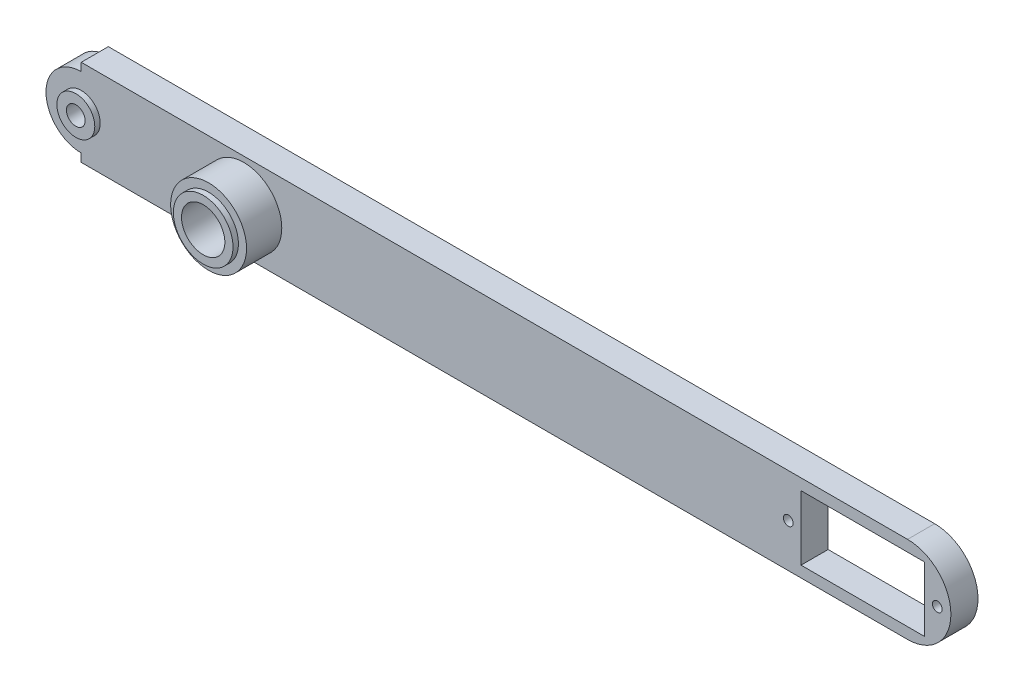
ISO-10303-21;
HEADER;
FILE_DESCRIPTION(('STEP AP214'),'2;1');
FILE_NAME('part.step','',(''),(''),'','','');
FILE_SCHEMA(('AUTOMOTIVE_DESIGN { 1 0 10303 214 1 1 1 1 }'));
ENDSEC;
DATA;
#1=APPLICATION_CONTEXT('core data for automotive mechanical design processes');
#2=APPLICATION_PROTOCOL_DEFINITION('international standard','automotive_design',2000,#1);
#3=PRODUCT_CONTEXT('',#1,'mechanical');
#4=PRODUCT('Part','Part','',(#3));
#5=PRODUCT_RELATED_PRODUCT_CATEGORY('part','',(#4));
#6=PRODUCT_DEFINITION_FORMATION('','',#4);
#7=PRODUCT_DEFINITION_CONTEXT('part definition',#1,'design');
#8=PRODUCT_DEFINITION('design','',#6,#7);
#9=PRODUCT_DEFINITION_SHAPE('','',#8);
#10=(LENGTH_UNIT() NAMED_UNIT(*) SI_UNIT(.MILLI.,.METRE.));
#11=(NAMED_UNIT(*) PLANE_ANGLE_UNIT() SI_UNIT($,.RADIAN.));
#12=(NAMED_UNIT(*) SI_UNIT($,.STERADIAN.) SOLID_ANGLE_UNIT());
#13=UNCERTAINTY_MEASURE_WITH_UNIT(LENGTH_MEASURE(1.E-05),#10,'distance_accuracy_value','');
#14=(GEOMETRIC_REPRESENTATION_CONTEXT(3) GLOBAL_UNCERTAINTY_ASSIGNED_CONTEXT((#13)) GLOBAL_UNIT_ASSIGNED_CONTEXT((#10,
#11,#12)) REPRESENTATION_CONTEXT('',''));
#15=CARTESIAN_POINT('',(0.,0.,0.));
#16=DIRECTION('',(0.,0.,1.));
#17=DIRECTION('',(1.,0.,0.));
#18=AXIS2_PLACEMENT_3D('',#15,#16,#17);
#19=CARTESIAN_POINT('',(-30.,8.,-4.));
#20=DIRECTION('',(1.,0.,0.));
#21=DIRECTION('',(0.,0.,-1.));
#22=AXIS2_PLACEMENT_3D('',#19,#20,#21);
#23=PLANE('',#22);
#24=DIRECTION('',(0.,0.,-1.));
#25=VECTOR('',#24,1.);
#26=CARTESIAN_POINT('',(-30.,-6.5,-4.));
#27=LINE('',#26,#25);
#28=CARTESIAN_POINT('',(-30.,-6.5,-9.));
#29=VERTEX_POINT('',#28);
#30=CARTESIAN_POINT('',(-30.,-6.5,-4.));
#31=VERTEX_POINT('',#30);
#32=EDGE_CURVE('E196',#29,#31,#27,.F.);
#33=ORIENTED_EDGE('',*,*,#32,.F.);
#34=DIRECTION('',(0.,-1.,0.));
#35=VECTOR('',#34,1.);
#36=CARTESIAN_POINT('',(-30.,8.,-9.));
#37=LINE('',#36,#35);
#38=CARTESIAN_POINT('',(-30.,-8.,-9.));
#39=VERTEX_POINT('',#38);
#40=EDGE_CURVE('E198',#29,#39,#37,.T.);
#41=ORIENTED_EDGE('',*,*,#40,.T.);
#42=DIRECTION('',(0.,0.,-1.));
#43=VECTOR('',#42,1.);
#44=CARTESIAN_POINT('',(-30.,-8.,-4.));
#45=LINE('',#44,#43);
#46=CARTESIAN_POINT('',(-30.,-8.,-4.));
#47=VERTEX_POINT('',#46);
#48=EDGE_CURVE('E50',#47,#39,#45,.T.);
#49=ORIENTED_EDGE('',*,*,#48,.F.);
#50=DIRECTION('',(0.,-1.,0.));
#51=VECTOR('',#50,1.);
#52=CARTESIAN_POINT('',(-30.,8.,-4.));
#53=LINE('',#52,#51);
#54=EDGE_CURVE('E203',#31,#47,#53,.T.);
#55=ORIENTED_EDGE('',*,*,#54,.F.);
#56=EDGE_LOOP('',(#33,#41,#49,#55));
#57=FACE_BOUND('',#56,.T.);
#58=ADVANCED_FACE('F39',(#57),#23,.F.);
#59=DIRECTION('',(0.,0.,-1.));
#60=VECTOR('',#59,1.);
#61=CARTESIAN_POINT('',(-30.,6.5,-4.));
#62=LINE('',#61,#60);
#63=CARTESIAN_POINT('',(-30.,6.5,-4.));
#64=VERTEX_POINT('',#63);
#65=CARTESIAN_POINT('',(-30.,6.5,-9.));
#66=VERTEX_POINT('',#65);
#67=EDGE_CURVE('E193',#64,#66,#62,.T.);
#68=ORIENTED_EDGE('',*,*,#67,.F.);
#69=CARTESIAN_POINT('',(-30.,8.,-4.));
#70=VERTEX_POINT('',#69);
#71=EDGE_CURVE('E200',#70,#64,#53,.T.);
#72=ORIENTED_EDGE('',*,*,#71,.F.);
#73=DIRECTION('',(0.,0.,-1.));
#74=VECTOR('',#73,1.);
#75=CARTESIAN_POINT('',(-30.,8.,-4.));
#76=LINE('',#75,#74);
#77=CARTESIAN_POINT('',(-30.,8.,-9.));
#78=VERTEX_POINT('',#77);
#79=EDGE_CURVE('E209',#70,#78,#76,.T.);
#80=ORIENTED_EDGE('',*,*,#79,.T.);
#81=EDGE_CURVE('E208',#78,#66,#37,.T.);
#82=ORIENTED_EDGE('',*,*,#81,.T.);
#83=EDGE_LOOP('',(#68,#72,#80,#82));
#84=FACE_BOUND('',#83,.T.);
#85=ADVANCED_FACE('F249',(#84),#23,.F.);
#86=CARTESIAN_POINT('',(-30.,-8.,-4.));
#87=DIRECTION('',(0.,1.,0.));
#88=DIRECTION('',(0.,0.,1.));
#89=AXIS2_PLACEMENT_3D('',#86,#87,#88);
#90=PLANE('',#89);
#91=DIRECTION('',(1.,0.,0.));
#92=VECTOR('',#91,1.);
#93=CARTESIAN_POINT('',(-30.,-8.,-9.));
#94=LINE('',#93,#92);
#95=CARTESIAN_POINT('',(122.45,-7.99999999999999,-9.));
#96=VERTEX_POINT('',#95);
#97=EDGE_CURVE('E214',#39,#96,#94,.T.);
#98=ORIENTED_EDGE('',*,*,#97,.T.);
#99=DIRECTION('',(0.,0.,-1.));
#100=VECTOR('',#99,1.);
#101=CARTESIAN_POINT('',(122.45,-8.,-4.));
#102=LINE('',#101,#100);
#103=CARTESIAN_POINT('',(122.45,-7.99999999999999,-4.));
#104=VERTEX_POINT('',#103);
#105=EDGE_CURVE('E225',#104,#96,#102,.T.);
#106=ORIENTED_EDGE('',*,*,#105,.F.);
#107=DIRECTION('',(1.,0.,0.));
#108=VECTOR('',#107,1.);
#109=CARTESIAN_POINT('',(-30.,-8.,-4.));
#110=LINE('',#109,#108);
#111=EDGE_CURVE('E202',#47,#104,#110,.T.);
#112=ORIENTED_EDGE('',*,*,#111,.F.);
#113=ORIENTED_EDGE('',*,*,#48,.T.);
#114=EDGE_LOOP('',(#98,#106,#112,#113));
#115=FACE_BOUND('',#114,.T.);
#116=ADVANCED_FACE('F227',(#115),#90,.F.);
#117=CARTESIAN_POINT('',(122.45,8.,-4.));
#118=DIRECTION('',(0.,-1.,0.));
#119=DIRECTION('',(0.,0.,-1.));
#120=AXIS2_PLACEMENT_3D('',#117,#118,#119);
#121=PLANE('',#120);
#122=DIRECTION('',(-1.,0.,0.));
#123=VECTOR('',#122,1.);
#124=CARTESIAN_POINT('',(122.45,8.,-9.));
#125=LINE('',#124,#123);
#126=CARTESIAN_POINT('',(122.45,8.,-9.));
#127=VERTEX_POINT('',#126);
#128=EDGE_CURVE('E211',#127,#78,#125,.T.);
#129=ORIENTED_EDGE('',*,*,#128,.T.);
#130=ORIENTED_EDGE('',*,*,#79,.F.);
#131=DIRECTION('',(-1.,0.,0.));
#132=VECTOR('',#131,1.);
#133=CARTESIAN_POINT('',(122.45,8.,-4.));
#134=LINE('',#133,#132);
#135=CARTESIAN_POINT('',(122.45,7.99999999999999,-4.));
#136=VERTEX_POINT('',#135);
#137=EDGE_CURVE('E210',#136,#70,#134,.T.);
#138=ORIENTED_EDGE('',*,*,#137,.F.);
#139=DIRECTION('',(0.,0.,-1.));
#140=VECTOR('',#139,1.);
#141=CARTESIAN_POINT('',(122.45,8.,-4.));
#142=LINE('',#141,#140);
#143=EDGE_CURVE('E218',#136,#127,#142,.T.);
#144=ORIENTED_EDGE('',*,*,#143,.T.);
#145=EDGE_LOOP('',(#129,#130,#138,#144));
#146=FACE_BOUND('',#145,.T.);
#147=ADVANCED_FACE('F241',(#146),#121,.F.);
#148=CARTESIAN_POINT('',(0.,0.,-4.));
#149=DIRECTION('',(0.,0.,1.));
#150=DIRECTION('',(1.,0.,0.));
#151=AXIS2_PLACEMENT_3D('',#148,#149,#150);
#152=PLANE('',#151);
#153=CARTESIAN_POINT('',(100.45,0.,-4.));
#154=DIRECTION('',(0.,0.,1.));
#155=DIRECTION('',(1.,0.,0.));
#156=AXIS2_PLACEMENT_3D('',#153,#154,#155);
#157=CIRCLE('',#156,0.899999999999998);
#158=CARTESIAN_POINT('',(101.35,0.,-4.));
#159=VERTEX_POINT('',#158);
#160=EDGE_CURVE('E136',#159,#159,#157,.T.);
#161=ORIENTED_EDGE('',*,*,#160,.F.);
#162=EDGE_LOOP('',(#161));
#163=FACE_BOUND('',#162,.T.);
#164=CARTESIAN_POINT('',(127.95,0.,-4.));
#165=DIRECTION('',(0.,0.,1.));
#166=DIRECTION('',(1.,0.,0.));
#167=AXIS2_PLACEMENT_3D('',#164,#165,#166);
#168=CIRCLE('',#167,0.900000000000012);
#169=CARTESIAN_POINT('',(128.85,0.,-4.));
#170=VERTEX_POINT('',#169);
#171=EDGE_CURVE('E138',#170,#170,#168,.T.);
#172=ORIENTED_EDGE('',*,*,#171,.F.);
#173=EDGE_LOOP('',(#172));
#174=FACE_BOUND('',#173,.T.);
#175=DIRECTION('',(0.,-1.,0.));
#176=VECTOR('',#175,1.);
#177=CARTESIAN_POINT('',(102.8,0.,-4.));
#178=LINE('',#177,#176);
#179=CARTESIAN_POINT('',(102.8,5.95,-4.));
#180=VERTEX_POINT('',#179);
#181=CARTESIAN_POINT('',(102.8,-5.95,-4.));
#182=VERTEX_POINT('',#181);
#183=EDGE_CURVE('E124',#180,#182,#178,.T.);
#184=ORIENTED_EDGE('',*,*,#183,.F.);
#185=DIRECTION('',(-1.,0.,0.));
#186=VECTOR('',#185,1.);
#187=CARTESIAN_POINT('',(0.,5.95,-4.));
#188=LINE('',#187,#186);
#189=CARTESIAN_POINT('',(125.6,5.95,-4.));
#190=VERTEX_POINT('',#189);
#191=EDGE_CURVE('E155',#190,#180,#188,.T.);
#192=ORIENTED_EDGE('',*,*,#191,.F.);
#193=DIRECTION('',(0.,1.,0.));
#194=VECTOR('',#193,1.);
#195=CARTESIAN_POINT('',(125.6,0.,-4.));
#196=LINE('',#195,#194);
#197=CARTESIAN_POINT('',(125.6,-5.95,-4.));
#198=VERTEX_POINT('',#197);
#199=EDGE_CURVE('E154',#198,#190,#196,.T.);
#200=ORIENTED_EDGE('',*,*,#199,.F.);
#201=DIRECTION('',(1.,0.,0.));
#202=VECTOR('',#201,1.);
#203=CARTESIAN_POINT('',(0.,-5.95,-4.));
#204=LINE('',#203,#202);
#205=EDGE_CURVE('E149',#182,#198,#204,.T.);
#206=ORIENTED_EDGE('',*,*,#205,.F.);
#207=EDGE_LOOP('',(#184,#192,#200,#206));
#208=FACE_BOUND('',#207,.T.);
#209=CARTESIAN_POINT('',(-30.,0.,-4.));
#210=DIRECTION('',(0.,0.,1.));
#211=DIRECTION('',(1.,0.,0.));
#212=AXIS2_PLACEMENT_3D('',#209,#210,#211);
#213=CIRCLE('',#212,3.5);
#214=CARTESIAN_POINT('',(-26.5,0.,-4.));
#215=VERTEX_POINT('',#214);
#216=EDGE_CURVE('E170',#215,#215,#213,.T.);
#217=ORIENTED_EDGE('',*,*,#216,.F.);
#218=EDGE_LOOP('',(#217));
#219=FACE_BOUND('',#218,.T.);
#220=CARTESIAN_POINT('',(0.,0.,-4.));
#221=DIRECTION('',(0.,0.,1.));
#222=DIRECTION('',(1.,0.,0.));
#223=AXIS2_PLACEMENT_3D('',#220,#221,#222);
#224=CIRCLE('',#223,7.);
#225=CARTESIAN_POINT('',(7.,0.,-4.));
#226=VERTEX_POINT('',#225);
#227=EDGE_CURVE('E177',#226,#226,#224,.F.);
#228=ORIENTED_EDGE('',*,*,#227,.T.);
#229=EDGE_LOOP('',(#228));
#230=FACE_BOUND('',#229,.T.);
#231=ORIENTED_EDGE('',*,*,#111,.T.);
#232=CARTESIAN_POINT('',(122.45,0.,-4.));
#233=DIRECTION('',(0.,0.,1.));
#234=DIRECTION('',(1.,0.,0.));
#235=AXIS2_PLACEMENT_3D('',#232,#233,#234);
#236=CIRCLE('',#235,7.99999999999999);
#237=EDGE_CURVE('E182',#104,#136,#236,.T.);
#238=ORIENTED_EDGE('',*,*,#237,.T.);
#239=ORIENTED_EDGE('',*,*,#137,.T.);
#240=ORIENTED_EDGE('',*,*,#71,.T.);
#241=CARTESIAN_POINT('',(-30.,0.,-4.));
#242=DIRECTION('',(0.,0.,1.));
#243=DIRECTION('',(1.,0.,0.));
#244=AXIS2_PLACEMENT_3D('',#241,#242,#243);
#245=CIRCLE('',#244,6.5);
#246=EDGE_CURVE('E189',#64,#31,#245,.T.);
#247=ORIENTED_EDGE('',*,*,#246,.T.);
#248=ORIENTED_EDGE('',*,*,#54,.T.);
#249=EDGE_LOOP('',(#231,#238,#239,#240,#247,#248));
#250=FACE_BOUND('',#249,.T.);
#251=ADVANCED_FACE('F244',(#163,#174,#208,#219,#230,#250),#152,.T.);
#252=CARTESIAN_POINT('',(0.,0.,-9.));
#253=DIRECTION('',(0.,0.,1.));
#254=DIRECTION('',(1.,0.,0.));
#255=AXIS2_PLACEMENT_3D('',#252,#253,#254);
#256=PLANE('',#255);
#257=CARTESIAN_POINT('',(100.45,0.,-9.));
#258=DIRECTION('',(0.,0.,1.));
#259=DIRECTION('',(1.,0.,0.));
#260=AXIS2_PLACEMENT_3D('',#257,#258,#259);
#261=CIRCLE('',#260,0.899999999999998);
#262=CARTESIAN_POINT('',(101.35,0.,-9.));
#263=VERTEX_POINT('',#262);
#264=EDGE_CURVE('E476',#263,#263,#261,.T.);
#265=ORIENTED_EDGE('',*,*,#264,.T.);
#266=EDGE_LOOP('',(#265));
#267=FACE_BOUND('',#266,.T.);
#268=CARTESIAN_POINT('',(127.95,0.,-9.));
#269=DIRECTION('',(0.,0.,1.));
#270=DIRECTION('',(1.,0.,0.));
#271=AXIS2_PLACEMENT_3D('',#268,#269,#270);
#272=CIRCLE('',#271,0.900000000000012);
#273=CARTESIAN_POINT('',(128.85,0.,-9.));
#274=VERTEX_POINT('',#273);
#275=EDGE_CURVE('E479',#274,#274,#272,.T.);
#276=ORIENTED_EDGE('',*,*,#275,.T.);
#277=EDGE_LOOP('',(#276));
#278=FACE_BOUND('',#277,.T.);
#279=DIRECTION('',(-1.,0.,0.));
#280=VECTOR('',#279,1.);
#281=CARTESIAN_POINT('',(125.6,5.95,-9.));
#282=LINE('',#281,#280);
#283=CARTESIAN_POINT('',(125.6,5.95,-9.));
#284=VERTEX_POINT('',#283);
#285=CARTESIAN_POINT('',(102.8,5.95,-9.));
#286=VERTEX_POINT('',#285);
#287=EDGE_CURVE('E128',#284,#286,#282,.T.);
#288=ORIENTED_EDGE('',*,*,#287,.T.);
#289=DIRECTION('',(0.,-1.,0.));
#290=VECTOR('',#289,1.);
#291=CARTESIAN_POINT('',(102.8,5.95,-9.));
#292=LINE('',#291,#290);
#293=CARTESIAN_POINT('',(102.8,-5.95,-9.));
#294=VERTEX_POINT('',#293);
#295=EDGE_CURVE('E119',#286,#294,#292,.T.);
#296=ORIENTED_EDGE('',*,*,#295,.T.);
#297=DIRECTION('',(1.,0.,0.));
#298=VECTOR('',#297,1.);
#299=CARTESIAN_POINT('',(102.8,-5.95,-9.));
#300=LINE('',#299,#298);
#301=CARTESIAN_POINT('',(125.6,-5.95,-9.));
#302=VERTEX_POINT('',#301);
#303=EDGE_CURVE('E130',#294,#302,#300,.T.);
#304=ORIENTED_EDGE('',*,*,#303,.T.);
#305=DIRECTION('',(0.,1.,0.));
#306=VECTOR('',#305,1.);
#307=CARTESIAN_POINT('',(125.6,-5.95,-9.));
#308=LINE('',#307,#306);
#309=EDGE_CURVE('E62',#302,#284,#308,.T.);
#310=ORIENTED_EDGE('',*,*,#309,.T.);
#311=EDGE_LOOP('',(#288,#296,#304,#310));
#312=FACE_BOUND('',#311,.T.);
#313=CARTESIAN_POINT('',(-30.,0.,-9.));
#314=DIRECTION('',(0.,0.,1.));
#315=DIRECTION('',(1.,0.,0.));
#316=AXIS2_PLACEMENT_3D('',#313,#314,#315);
#317=CIRCLE('',#316,1.725);
#318=CARTESIAN_POINT('',(-28.275,0.,-9.));
#319=VERTEX_POINT('',#318);
#320=EDGE_CURVE('E157',#319,#319,#317,.T.);
#321=ORIENTED_EDGE('',*,*,#320,.T.);
#322=EDGE_LOOP('',(#321));
#323=FACE_BOUND('',#322,.T.);
#324=CARTESIAN_POINT('',(0.,0.,-9.));
#325=DIRECTION('',(0.,0.,1.));
#326=DIRECTION('',(1.,0.,0.));
#327=AXIS2_PLACEMENT_3D('',#324,#325,#326);
#328=CIRCLE('',#327,4.);
#329=CARTESIAN_POINT('',(4.,0.,-9.));
#330=VERTEX_POINT('',#329);
#331=EDGE_CURVE('E165',#330,#330,#328,.T.);
#332=ORIENTED_EDGE('',*,*,#331,.T.);
#333=EDGE_LOOP('',(#332));
#334=FACE_BOUND('',#333,.T.);
#335=ORIENTED_EDGE('',*,*,#128,.F.);
#336=CARTESIAN_POINT('',(122.45,0.,-9.));
#337=DIRECTION('',(0.,0.,1.));
#338=DIRECTION('',(1.,0.,0.));
#339=AXIS2_PLACEMENT_3D('',#336,#337,#338);
#340=CIRCLE('',#339,7.99999999999999);
#341=EDGE_CURVE('E185',#96,#127,#340,.T.);
#342=ORIENTED_EDGE('',*,*,#341,.F.);
#343=ORIENTED_EDGE('',*,*,#97,.F.);
#344=ORIENTED_EDGE('',*,*,#40,.F.);
#345=CARTESIAN_POINT('',(-30.,0.,-9.));
#346=DIRECTION('',(0.,0.,1.));
#347=DIRECTION('',(1.,0.,0.));
#348=AXIS2_PLACEMENT_3D('',#345,#346,#347);
#349=CIRCLE('',#348,6.5);
#350=EDGE_CURVE('E187',#66,#29,#349,.T.);
#351=ORIENTED_EDGE('',*,*,#350,.F.);
#352=ORIENTED_EDGE('',*,*,#81,.F.);
#353=EDGE_LOOP('',(#335,#342,#343,#344,#351,#352));
#354=FACE_BOUND('',#353,.T.);
#355=ADVANCED_FACE('F134',(#267,#278,#312,#323,#334,#354),#256,.F.);
#356=CARTESIAN_POINT('',(-30.,0.,-4.));
#357=DIRECTION('',(0.,0.,-1.));
#358=DIRECTION('',(-1.,0.,0.));
#359=AXIS2_PLACEMENT_3D('',#356,#357,#358);
#360=CYLINDRICAL_SURFACE('',#359,6.5);
#361=ORIENTED_EDGE('',*,*,#350,.T.);
#362=ORIENTED_EDGE('',*,*,#32,.T.);
#363=ORIENTED_EDGE('',*,*,#246,.F.);
#364=ORIENTED_EDGE('',*,*,#67,.T.);
#365=EDGE_LOOP('',(#361,#362,#363,#364));
#366=FACE_BOUND('',#365,.T.);
#367=ADVANCED_FACE('F247',(#366),#360,.T.);
#368=CARTESIAN_POINT('',(122.45,0.,-4.));
#369=DIRECTION('',(0.,0.,-1.));
#370=DIRECTION('',(-1.,0.,0.));
#371=AXIS2_PLACEMENT_3D('',#368,#369,#370);
#372=CYLINDRICAL_SURFACE('',#371,7.99999999999999);
#373=ORIENTED_EDGE('',*,*,#237,.F.);
#374=ORIENTED_EDGE('',*,*,#105,.T.);
#375=ORIENTED_EDGE('',*,*,#341,.T.);
#376=ORIENTED_EDGE('',*,*,#143,.F.);
#377=EDGE_LOOP('',(#373,#374,#375,#376));
#378=FACE_BOUND('',#377,.T.);
#379=ADVANCED_FACE('F238',(#378),#372,.T.);
#380=CARTESIAN_POINT('',(0.,0.,2.5));
#381=DIRECTION('',(0.,0.,-1.));
#382=DIRECTION('',(-1.,0.,0.));
#383=AXIS2_PLACEMENT_3D('',#380,#381,#382);
#384=CYLINDRICAL_SURFACE('',#383,7.);
#385=ORIENTED_EDGE('',*,*,#227,.F.);
#386=EDGE_LOOP('',(#385));
#387=FACE_BOUND('',#386,.T.);
#388=CARTESIAN_POINT('',(0.,0.,2.5));
#389=DIRECTION('',(0.,0.,1.));
#390=DIRECTION('',(1.,0.,0.));
#391=AXIS2_PLACEMENT_3D('',#388,#389,#390);
#392=CIRCLE('',#391,7.);
#393=CARTESIAN_POINT('',(7.,0.,2.5));
#394=VERTEX_POINT('',#393);
#395=EDGE_CURVE('E174',#394,#394,#392,.T.);
#396=ORIENTED_EDGE('',*,*,#395,.F.);
#397=EDGE_LOOP('',(#396));
#398=FACE_BOUND('',#397,.T.);
#399=ADVANCED_FACE('F276',(#387,#398),#384,.T.);
#400=CARTESIAN_POINT('',(0.,0.,2.5));
#401=DIRECTION('',(0.,0.,1.));
#402=DIRECTION('',(1.,0.,0.));
#403=AXIS2_PLACEMENT_3D('',#400,#401,#402);
#404=PLANE('',#403);
#405=CARTESIAN_POINT('',(0.,0.,2.5));
#406=DIRECTION('',(0.,0.,1.));
#407=DIRECTION('',(1.,0.,0.));
#408=AXIS2_PLACEMENT_3D('',#405,#406,#407);
#409=CIRCLE('',#408,5.5);
#410=CARTESIAN_POINT('',(5.5,0.,2.5));
#411=VERTEX_POINT('',#410);
#412=EDGE_CURVE('E11',#411,#411,#409,.T.);
#413=ORIENTED_EDGE('',*,*,#412,.F.);
#414=EDGE_LOOP('',(#413));
#415=FACE_BOUND('',#414,.T.);
#416=ORIENTED_EDGE('',*,*,#395,.T.);
#417=EDGE_LOOP('',(#416));
#418=FACE_BOUND('',#417,.T.);
#419=ADVANCED_FACE('F288',(#415,#418),#404,.T.);
#420=CARTESIAN_POINT('',(0.,0.,3.5));
#421=DIRECTION('',(0.,0.,-1.));
#422=DIRECTION('',(-1.,0.,0.));
#423=AXIS2_PLACEMENT_3D('',#420,#421,#422);
#424=CYLINDRICAL_SURFACE('',#423,5.5);
#425=CARTESIAN_POINT('',(0.,0.,3.5));
#426=DIRECTION('',(0.,0.,1.));
#427=DIRECTION('',(1.,0.,0.));
#428=AXIS2_PLACEMENT_3D('',#425,#426,#427);
#429=CIRCLE('',#428,5.5);
#430=CARTESIAN_POINT('',(5.5,0.,3.5));
#431=VERTEX_POINT('',#430);
#432=EDGE_CURVE('E171',#431,#431,#429,.T.);
#433=ORIENTED_EDGE('',*,*,#432,.F.);
#434=EDGE_LOOP('',(#433));
#435=FACE_BOUND('',#434,.T.);
#436=ORIENTED_EDGE('',*,*,#412,.T.);
#437=EDGE_LOOP('',(#436));
#438=FACE_BOUND('',#437,.T.);
#439=ADVANCED_FACE('F296',(#435,#438),#424,.T.);
#440=CARTESIAN_POINT('',(0.,0.,3.5));
#441=DIRECTION('',(0.,0.,1.));
#442=DIRECTION('',(1.,0.,0.));
#443=AXIS2_PLACEMENT_3D('',#440,#441,#442);
#444=PLANE('',#443);
#445=CARTESIAN_POINT('',(0.,0.,3.5));
#446=DIRECTION('',(0.,0.,1.));
#447=DIRECTION('',(1.,0.,0.));
#448=AXIS2_PLACEMENT_3D('',#445,#446,#447);
#449=CIRCLE('',#448,4.);
#450=CARTESIAN_POINT('',(4.,0.,3.5));
#451=VERTEX_POINT('',#450);
#452=EDGE_CURVE('E163',#451,#451,#449,.T.);
#453=ORIENTED_EDGE('',*,*,#452,.F.);
#454=EDGE_LOOP('',(#453));
#455=FACE_BOUND('',#454,.T.);
#456=ORIENTED_EDGE('',*,*,#432,.T.);
#457=EDGE_LOOP('',(#456));
#458=FACE_BOUND('',#457,.T.);
#459=ADVANCED_FACE('F310',(#455,#458),#444,.T.);
#460=CARTESIAN_POINT('',(-30.,0.,-3.));
#461=DIRECTION('',(0.,0.,-1.));
#462=DIRECTION('',(-1.,0.,0.));
#463=AXIS2_PLACEMENT_3D('',#460,#461,#462);
#464=CYLINDRICAL_SURFACE('',#463,3.5);
#465=CARTESIAN_POINT('',(-30.,0.,-3.));
#466=DIRECTION('',(0.,0.,1.));
#467=DIRECTION('',(1.,0.,0.));
#468=AXIS2_PLACEMENT_3D('',#465,#466,#467);
#469=CIRCLE('',#468,3.5);
#470=CARTESIAN_POINT('',(-26.5,0.,-3.));
#471=VERTEX_POINT('',#470);
#472=EDGE_CURVE('E166',#471,#471,#469,.T.);
#473=ORIENTED_EDGE('',*,*,#472,.F.);
#474=EDGE_LOOP('',(#473));
#475=FACE_BOUND('',#474,.T.);
#476=ORIENTED_EDGE('',*,*,#216,.T.);
#477=EDGE_LOOP('',(#476));
#478=FACE_BOUND('',#477,.T.);
#479=ADVANCED_FACE('F317',(#475,#478),#464,.T.);
#480=CARTESIAN_POINT('',(-30.,0.,-3.));
#481=DIRECTION('',(0.,0.,1.));
#482=DIRECTION('',(1.,0.,0.));
#483=AXIS2_PLACEMENT_3D('',#480,#481,#482);
#484=PLANE('',#483);
#485=CARTESIAN_POINT('',(-30.,0.,-3.));
#486=DIRECTION('',(0.,0.,1.));
#487=DIRECTION('',(1.,0.,0.));
#488=AXIS2_PLACEMENT_3D('',#485,#486,#487);
#489=CIRCLE('',#488,1.725);
#490=CARTESIAN_POINT('',(-28.275,0.,-3.));
#491=VERTEX_POINT('',#490);
#492=EDGE_CURVE('E45',#491,#491,#489,.T.);
#493=ORIENTED_EDGE('',*,*,#492,.F.);
#494=EDGE_LOOP('',(#493));
#495=FACE_BOUND('',#494,.T.);
#496=ORIENTED_EDGE('',*,*,#472,.T.);
#497=EDGE_LOOP('',(#496));
#498=FACE_BOUND('',#497,.T.);
#499=ADVANCED_FACE('F321',(#495,#498),#484,.T.);
#500=CARTESIAN_POINT('',(0.,0.,-9.));
#501=DIRECTION('',(0.,0.,1.));
#502=DIRECTION('',(1.,0.,0.));
#503=AXIS2_PLACEMENT_3D('',#500,#501,#502);
#504=CYLINDRICAL_SURFACE('',#503,4.);
#505=ORIENTED_EDGE('',*,*,#331,.F.);
#506=EDGE_LOOP('',(#505));
#507=FACE_BOUND('',#506,.T.);
#508=ORIENTED_EDGE('',*,*,#452,.T.);
#509=EDGE_LOOP('',(#508));
#510=FACE_BOUND('',#509,.T.);
#511=ADVANCED_FACE('F333',(#507,#510),#504,.F.);
#512=CARTESIAN_POINT('',(-30.,0.,-9.));
#513=DIRECTION('',(0.,0.,1.));
#514=DIRECTION('',(1.,0.,0.));
#515=AXIS2_PLACEMENT_3D('',#512,#513,#514);
#516=CYLINDRICAL_SURFACE('',#515,1.725);
#517=ORIENTED_EDGE('',*,*,#492,.T.);
#518=EDGE_LOOP('',(#517));
#519=FACE_BOUND('',#518,.T.);
#520=ORIENTED_EDGE('',*,*,#320,.F.);
#521=EDGE_LOOP('',(#520));
#522=FACE_BOUND('',#521,.T.);
#523=ADVANCED_FACE('F342',(#519,#522),#516,.F.);
#524=CARTESIAN_POINT('',(102.8,5.95,-9.));
#525=DIRECTION('',(-1.,0.,0.));
#526=DIRECTION('',(0.,0.,1.));
#527=AXIS2_PLACEMENT_3D('',#524,#525,#526);
#528=PLANE('',#527);
#529=ORIENTED_EDGE('',*,*,#183,.T.);
#530=DIRECTION('',(0.,0.,1.));
#531=VECTOR('',#530,1.);
#532=CARTESIAN_POINT('',(102.8,-5.95,-9.));
#533=LINE('',#532,#531);
#534=EDGE_CURVE('E54',#294,#182,#533,.T.);
#535=ORIENTED_EDGE('',*,*,#534,.F.);
#536=ORIENTED_EDGE('',*,*,#295,.F.);
#537=DIRECTION('',(0.,0.,1.));
#538=VECTOR('',#537,1.);
#539=CARTESIAN_POINT('',(102.8,5.95,-9.));
#540=LINE('',#539,#538);
#541=EDGE_CURVE('E143',#286,#180,#540,.T.);
#542=ORIENTED_EDGE('',*,*,#541,.T.);
#543=EDGE_LOOP('',(#529,#535,#536,#542));
#544=FACE_BOUND('',#543,.T.);
#545=ADVANCED_FACE('F120',(#544),#528,.F.);
#546=CARTESIAN_POINT('',(125.6,5.95,-9.));
#547=DIRECTION('',(0.,1.,0.));
#548=DIRECTION('',(0.,0.,1.));
#549=AXIS2_PLACEMENT_3D('',#546,#547,#548);
#550=PLANE('',#549);
#551=ORIENTED_EDGE('',*,*,#191,.T.);
#552=ORIENTED_EDGE('',*,*,#541,.F.);
#553=ORIENTED_EDGE('',*,*,#287,.F.);
#554=DIRECTION('',(0.,0.,1.));
#555=VECTOR('',#554,1.);
#556=CARTESIAN_POINT('',(125.6,5.95,-9.));
#557=LINE('',#556,#555);
#558=EDGE_CURVE('E147',#284,#190,#557,.T.);
#559=ORIENTED_EDGE('',*,*,#558,.T.);
#560=EDGE_LOOP('',(#551,#552,#553,#559));
#561=FACE_BOUND('',#560,.T.);
#562=ADVANCED_FACE('F359',(#561),#550,.F.);
#563=CARTESIAN_POINT('',(125.6,-5.95,-9.));
#564=DIRECTION('',(1.,0.,0.));
#565=DIRECTION('',(0.,0.,-1.));
#566=AXIS2_PLACEMENT_3D('',#563,#564,#565);
#567=PLANE('',#566);
#568=ORIENTED_EDGE('',*,*,#199,.T.);
#569=ORIENTED_EDGE('',*,*,#558,.F.);
#570=ORIENTED_EDGE('',*,*,#309,.F.);
#571=DIRECTION('',(0.,0.,1.));
#572=VECTOR('',#571,1.);
#573=CARTESIAN_POINT('',(125.6,-5.95,-9.));
#574=LINE('',#573,#572);
#575=EDGE_CURVE('E123',#302,#198,#574,.T.);
#576=ORIENTED_EDGE('',*,*,#575,.T.);
#577=EDGE_LOOP('',(#568,#569,#570,#576));
#578=FACE_BOUND('',#577,.T.);
#579=ADVANCED_FACE('F368',(#578),#567,.F.);
#580=CARTESIAN_POINT('',(102.8,-5.95,-9.));
#581=DIRECTION('',(0.,-1.,0.));
#582=DIRECTION('',(0.,0.,-1.));
#583=AXIS2_PLACEMENT_3D('',#580,#581,#582);
#584=PLANE('',#583);
#585=ORIENTED_EDGE('',*,*,#205,.T.);
#586=ORIENTED_EDGE('',*,*,#575,.F.);
#587=ORIENTED_EDGE('',*,*,#303,.F.);
#588=ORIENTED_EDGE('',*,*,#534,.T.);
#589=EDGE_LOOP('',(#585,#586,#587,#588));
#590=FACE_BOUND('',#589,.T.);
#591=ADVANCED_FACE('F126',(#590),#584,.F.);
#592=CARTESIAN_POINT('',(127.95,0.,-9.));
#593=DIRECTION('',(0.,0.,1.));
#594=DIRECTION('',(1.,0.,0.));
#595=AXIS2_PLACEMENT_3D('',#592,#593,#594);
#596=CYLINDRICAL_SURFACE('',#595,0.900000000000012);
#597=ORIENTED_EDGE('',*,*,#171,.T.);
#598=EDGE_LOOP('',(#597));
#599=FACE_BOUND('',#598,.T.);
#600=ORIENTED_EDGE('',*,*,#275,.F.);
#601=EDGE_LOOP('',(#600));
#602=FACE_BOUND('',#601,.T.);
#603=ADVANCED_FACE('F381',(#599,#602),#596,.F.);
#604=CARTESIAN_POINT('',(100.45,0.,-9.));
#605=DIRECTION('',(0.,0.,1.));
#606=DIRECTION('',(1.,0.,0.));
#607=AXIS2_PLACEMENT_3D('',#604,#605,#606);
#608=CYLINDRICAL_SURFACE('',#607,0.899999999999998);
#609=ORIENTED_EDGE('',*,*,#160,.T.);
#610=EDGE_LOOP('',(#609));
#611=FACE_BOUND('',#610,.T.);
#612=ORIENTED_EDGE('',*,*,#264,.F.);
#613=EDGE_LOOP('',(#612));
#614=FACE_BOUND('',#613,.T.);
#615=ADVANCED_FACE('F392',(#611,#614),#608,.F.);
#616=CLOSED_SHELL('',(#58,#85,#116,#147,#251,#355,#367,#379,#399,#419,#439,#459,#479,#499,#511,
#523,#545,#562,#579,#591,#603,#615));
#617=MANIFOLD_SOLID_BREP('B2',#616);
#618=ADVANCED_BREP_SHAPE_REPRESENTATION('',(#18,#617),#14);
#619=SHAPE_DEFINITION_REPRESENTATION(#9,#618);
ENDSEC;
END-ISO-10303-21;
